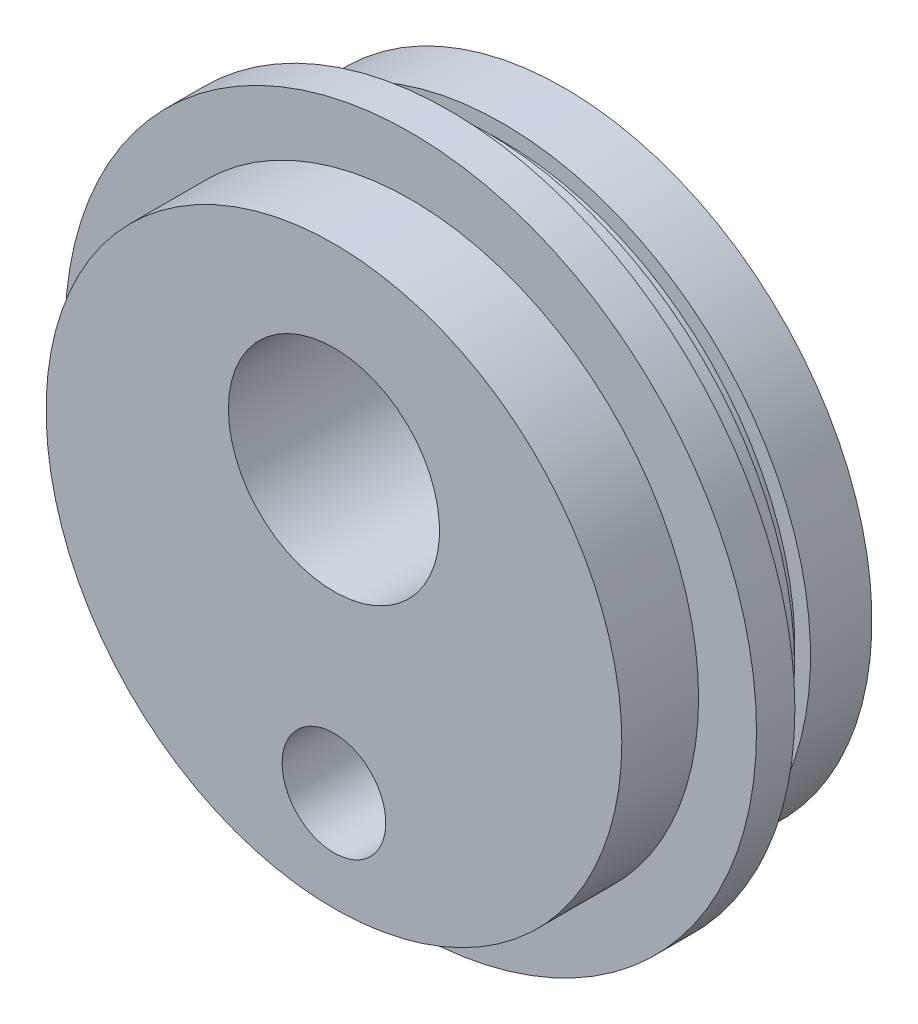
ISO-10303-21;
HEADER;
FILE_DESCRIPTION(('STEP AP214'),'2;1');
FILE_NAME('part.step','',(''),(''),'','','');
FILE_SCHEMA(('AUTOMOTIVE_DESIGN { 1 0 10303 214 1 1 1 1 }'));
ENDSEC;
DATA;
#1=APPLICATION_CONTEXT('core data for automotive mechanical design processes');
#2=APPLICATION_PROTOCOL_DEFINITION('international standard','automotive_design',2000,#1);
#3=PRODUCT_CONTEXT('',#1,'mechanical');
#4=PRODUCT('Part','Part','',(#3));
#5=PRODUCT_RELATED_PRODUCT_CATEGORY('part','',(#4));
#6=PRODUCT_DEFINITION_FORMATION('','',#4);
#7=PRODUCT_DEFINITION_CONTEXT('part definition',#1,'design');
#8=PRODUCT_DEFINITION('design','',#6,#7);
#9=PRODUCT_DEFINITION_SHAPE('','',#8);
#10=(LENGTH_UNIT() NAMED_UNIT(*) SI_UNIT(.MILLI.,.METRE.));
#11=(NAMED_UNIT(*) PLANE_ANGLE_UNIT() SI_UNIT($,.RADIAN.));
#12=(NAMED_UNIT(*) SI_UNIT($,.STERADIAN.) SOLID_ANGLE_UNIT());
#13=UNCERTAINTY_MEASURE_WITH_UNIT(LENGTH_MEASURE(1.E-05),#10,'distance_accuracy_value','');
#14=(GEOMETRIC_REPRESENTATION_CONTEXT(3) GLOBAL_UNCERTAINTY_ASSIGNED_CONTEXT((#13)) GLOBAL_UNIT_ASSIGNED_CONTEXT((#10,
#11,#12)) REPRESENTATION_CONTEXT('',''));
#15=CARTESIAN_POINT('',(0.,0.,0.));
#16=DIRECTION('',(0.,0.,1.));
#17=DIRECTION('',(1.,0.,0.));
#18=AXIS2_PLACEMENT_3D('',#15,#16,#17);
#19=CARTESIAN_POINT('',(0.,1.66533453693773E-13,12.7));
#20=DIRECTION('',(0.,0.,1.));
#21=DIRECTION('',(1.,0.,0.));
#22=AXIS2_PLACEMENT_3D('',#19,#20,#21);
#23=PLANE('',#22);
#24=CARTESIAN_POINT('',(0.,1.66533453693773E-13,12.7));
#25=DIRECTION('',(0.,0.,1.));
#26=DIRECTION('',(1.,0.,0.));
#27=AXIS2_PLACEMENT_3D('',#24,#25,#26);
#28=CIRCLE('',#27,47.625);
#29=CARTESIAN_POINT('',(47.625,1.66533453693773E-13,12.7));
#30=VERTEX_POINT('',#29);
#31=EDGE_CURVE('E62',#30,#30,#28,.T.);
#32=ORIENTED_EDGE('',*,*,#31,.F.);
#33=EDGE_LOOP('',(#32));
#34=FACE_BOUND('',#33,.T.);
#35=CARTESIAN_POINT('',(0.,1.66533453693773E-13,12.7));
#36=DIRECTION('',(0.,0.,1.));
#37=DIRECTION('',(1.,0.,0.));
#38=AXIS2_PLACEMENT_3D('',#35,#36,#37);
#39=CIRCLE('',#38,57.2063948651031);
#40=CARTESIAN_POINT('',(57.2063948651031,1.66533453693773E-13,12.7));
#41=VERTEX_POINT('',#40);
#42=EDGE_CURVE('E59',#41,#41,#39,.T.);
#43=ORIENTED_EDGE('',*,*,#42,.T.);
#44=EDGE_LOOP('',(#43));
#45=FACE_BOUND('',#44,.T.);
#46=ADVANCED_FACE('F38',(#34,#45),#23,.T.);
#47=CARTESIAN_POINT('',(0.,1.66533453693773E-13,12.7));
#48=DIRECTION('',(0.,0.,1.));
#49=DIRECTION('',(1.,0.,0.));
#50=AXIS2_PLACEMENT_3D('',#47,#48,#49);
#51=CYLINDRICAL_SURFACE('',#50,47.625);
#52=ORIENTED_EDGE('',*,*,#31,.T.);
#53=EDGE_LOOP('',(#52));
#54=FACE_BOUND('',#53,.T.);
#55=CARTESIAN_POINT('',(0.,0.,25.4));
#56=DIRECTION('',(0.,0.,1.));
#57=DIRECTION('',(1.,0.,0.));
#58=AXIS2_PLACEMENT_3D('',#55,#56,#57);
#59=CIRCLE('',#58,47.625);
#60=CARTESIAN_POINT('',(47.625,0.,25.4));
#61=VERTEX_POINT('',#60);
#62=EDGE_CURVE('E58',#61,#61,#59,.T.);
#63=ORIENTED_EDGE('',*,*,#62,.F.);
#64=EDGE_LOOP('',(#63));
#65=FACE_BOUND('',#64,.T.);
#66=ADVANCED_FACE('F85',(#54,#65),#51,.T.);
#67=CARTESIAN_POINT('',(0.,0.,25.4));
#68=DIRECTION('',(0.,0.,1.));
#69=DIRECTION('',(1.,0.,0.));
#70=AXIS2_PLACEMENT_3D('',#67,#68,#69);
#71=PLANE('',#70);
#72=CARTESIAN_POINT('',(1.66533453693773E-13,-31.0864832251811,25.4));
#73=DIRECTION('',(0.,0.,-1.));
#74=DIRECTION('',(-1.,0.,0.));
#75=AXIS2_PLACEMENT_3D('',#72,#73,#74);
#76=CIRCLE('',#75,8.5725);
#77=CARTESIAN_POINT('',(-8.57249999999983,-31.0864832251811,25.4));
#78=VERTEX_POINT('',#77);
#79=EDGE_CURVE('E106',#78,#78,#76,.T.);
#80=ORIENTED_EDGE('',*,*,#79,.T.);
#81=EDGE_LOOP('',(#80));
#82=FACE_BOUND('',#81,.T.);
#83=CARTESIAN_POINT('',(0.,15.2399999999999,25.4));
#84=DIRECTION('',(0.,0.,-1.));
#85=DIRECTION('',(-1.,0.,0.));
#86=AXIS2_PLACEMENT_3D('',#83,#84,#85);
#87=CIRCLE('',#86,17.4625);
#88=CARTESIAN_POINT('',(-17.4625,15.2399999999999,25.4));
#89=VERTEX_POINT('',#88);
#90=EDGE_CURVE('E110',#89,#89,#87,.T.);
#91=ORIENTED_EDGE('',*,*,#90,.T.);
#92=EDGE_LOOP('',(#91));
#93=FACE_BOUND('',#92,.T.);
#94=ORIENTED_EDGE('',*,*,#62,.T.);
#95=EDGE_LOOP('',(#94));
#96=FACE_BOUND('',#95,.T.);
#97=ADVANCED_FACE('F91',(#82,#93,#96),#71,.T.);
#98=CARTESIAN_POINT('',(0.,0.,6.35000000000002));
#99=DIRECTION('',(0.,0.,1.));
#100=DIRECTION('',(1.,0.,0.));
#101=AXIS2_PLACEMENT_3D('',#98,#99,#100);
#102=CYLINDRICAL_SURFACE('',#101,57.2063948651031);
#103=CARTESIAN_POINT('',(0.,0.,6.35000000000002));
#104=DIRECTION('',(0.,0.,1.));
#105=DIRECTION('',(1.,0.,0.));
#106=AXIS2_PLACEMENT_3D('',#103,#104,#105);
#107=CIRCLE('',#106,57.2063948651031);
#108=CARTESIAN_POINT('',(57.2063948651031,0.,6.35000000000002));
#109=VERTEX_POINT('',#108);
#110=EDGE_CURVE('E55',#109,#109,#107,.T.);
#111=ORIENTED_EDGE('',*,*,#110,.T.);
#112=EDGE_LOOP('',(#111));
#113=FACE_BOUND('',#112,.T.);
#114=ORIENTED_EDGE('',*,*,#42,.F.);
#115=EDGE_LOOP('',(#114));
#116=FACE_BOUND('',#115,.T.);
#117=ADVANCED_FACE('F80',(#113,#116),#102,.T.);
#118=CARTESIAN_POINT('',(0.,0.,6.35000000000002));
#119=DIRECTION('',(0.,0.,1.));
#120=DIRECTION('',(1.,0.,0.));
#121=AXIS2_PLACEMENT_3D('',#118,#119,#120);
#122=PLANE('',#121);
#123=CARTESIAN_POINT('',(0.,0.,6.35000000000002));
#124=DIRECTION('',(0.,0.,1.));
#125=DIRECTION('',(1.,0.,0.));
#126=AXIS2_PLACEMENT_3D('',#123,#124,#125);
#127=CIRCLE('',#126,50.8);
#128=CARTESIAN_POINT('',(50.8,0.,6.35000000000002));
#129=VERTEX_POINT('',#128);
#130=EDGE_CURVE('E42',#129,#129,#127,.T.);
#131=ORIENTED_EDGE('',*,*,#130,.T.);
#132=EDGE_LOOP('',(#131));
#133=FACE_BOUND('',#132,.T.);
#134=ORIENTED_EDGE('',*,*,#110,.F.);
#135=EDGE_LOOP('',(#134));
#136=FACE_BOUND('',#135,.T.);
#137=ADVANCED_FACE('F73',(#133,#136),#122,.F.);
#138=CARTESIAN_POINT('',(0.,0.,0.));
#139=DIRECTION('',(0.,0.,1.));
#140=DIRECTION('',(1.,0.,0.));
#141=AXIS2_PLACEMENT_3D('',#138,#139,#140);
#142=PLANE('',#141);
#143=CARTESIAN_POINT('',(0.,0.,0.));
#144=DIRECTION('',(0.,0.,-1.));
#145=DIRECTION('',(-1.,0.,0.));
#146=AXIS2_PLACEMENT_3D('',#143,#144,#145);
#147=CIRCLE('',#146,48.3079575650415);
#148=CARTESIAN_POINT('',(-48.3079575650415,0.,0.));
#149=VERTEX_POINT('',#148);
#150=EDGE_CURVE('E11',#149,#149,#147,.T.);
#151=ORIENTED_EDGE('',*,*,#150,.F.);
#152=EDGE_LOOP('',(#151));
#153=FACE_BOUND('',#152,.T.);
#154=CARTESIAN_POINT('',(0.,0.,0.));
#155=DIRECTION('',(0.,0.,1.));
#156=DIRECTION('',(1.,0.,0.));
#157=AXIS2_PLACEMENT_3D('',#154,#155,#156);
#158=CIRCLE('',#157,50.8);
#159=CARTESIAN_POINT('',(50.8,0.,0.));
#160=VERTEX_POINT('',#159);
#161=EDGE_CURVE('E50',#160,#160,#158,.T.);
#162=ORIENTED_EDGE('',*,*,#161,.F.);
#163=EDGE_LOOP('',(#162));
#164=FACE_BOUND('',#163,.T.);
#165=ADVANCED_FACE('F71',(#153,#164),#142,.F.);
#166=CARTESIAN_POINT('',(0.,0.,25.4));
#167=DIRECTION('',(0.,0.,-1.));
#168=DIRECTION('',(-1.,0.,0.));
#169=AXIS2_PLACEMENT_3D('',#166,#167,#168);
#170=CYLINDRICAL_SURFACE('',#169,50.8);
#171=ORIENTED_EDGE('',*,*,#161,.T.);
#172=EDGE_LOOP('',(#171));
#173=FACE_BOUND('',#172,.T.);
#174=ORIENTED_EDGE('',*,*,#130,.F.);
#175=EDGE_LOOP('',(#174));
#176=FACE_BOUND('',#175,.T.);
#177=ADVANCED_FACE('F40',(#173,#176),#170,.T.);
#178=CARTESIAN_POINT('',(0.,1.66533453693773E-13,-2.53999999999999));
#179=DIRECTION('',(0.,0.,1.));
#180=DIRECTION('',(1.,0.,0.));
#181=AXIS2_PLACEMENT_3D('',#178,#179,#180);
#182=CYLINDRICAL_SURFACE('',#181,48.3079575650415);
#183=CARTESIAN_POINT('',(0.,1.66533453693773E-13,-2.53999999999999));
#184=DIRECTION('',(0.,0.,-1.));
#185=DIRECTION('',(-1.,0.,0.));
#186=AXIS2_PLACEMENT_3D('',#183,#184,#185);
#187=CIRCLE('',#186,48.3079575650415);
#188=CARTESIAN_POINT('',(-48.3079575650415,1.66533453693773E-13,-2.53999999999999));
#189=VERTEX_POINT('',#188);
#190=EDGE_CURVE('E53',#189,#189,#187,.T.);
#191=ORIENTED_EDGE('',*,*,#190,.F.);
#192=EDGE_LOOP('',(#191));
#193=FACE_BOUND('',#192,.T.);
#194=ORIENTED_EDGE('',*,*,#150,.T.);
#195=EDGE_LOOP('',(#194));
#196=FACE_BOUND('',#195,.T.);
#197=ADVANCED_FACE('F79',(#193,#196),#182,.T.);
#198=CARTESIAN_POINT('',(1.66533453693773E-13,0.,-12.7));
#199=DIRECTION('',(0.,0.,1.));
#200=DIRECTION('',(1.,0.,0.));
#201=AXIS2_PLACEMENT_3D('',#198,#199,#200);
#202=CYLINDRICAL_SURFACE('',#201,50.9005831859003);
#203=CARTESIAN_POINT('',(1.66533453693773E-13,0.,-12.7));
#204=DIRECTION('',(0.,0.,-1.));
#205=DIRECTION('',(-1.,0.,0.));
#206=AXIS2_PLACEMENT_3D('',#203,#204,#205);
#207=CIRCLE('',#206,50.9005831859003);
#208=CARTESIAN_POINT('',(-50.9005831859001,0.,-12.7));
#209=VERTEX_POINT('',#208);
#210=EDGE_CURVE('E118',#209,#209,#207,.T.);
#211=ORIENTED_EDGE('',*,*,#210,.F.);
#212=EDGE_LOOP('',(#211));
#213=FACE_BOUND('',#212,.T.);
#214=CARTESIAN_POINT('',(0.,1.66533453693773E-13,-2.53999999999999));
#215=DIRECTION('',(0.,0.,-1.));
#216=DIRECTION('',(-1.,0.,0.));
#217=AXIS2_PLACEMENT_3D('',#214,#215,#216);
#218=CIRCLE('',#217,50.9005831859003);
#219=CARTESIAN_POINT('',(-50.9005831859003,1.66533453693773E-13,-2.53999999999999));
#220=VERTEX_POINT('',#219);
#221=EDGE_CURVE('E114',#220,#220,#218,.T.);
#222=ORIENTED_EDGE('',*,*,#221,.T.);
#223=EDGE_LOOP('',(#222));
#224=FACE_BOUND('',#223,.T.);
#225=ADVANCED_FACE('F133',(#213,#224),#202,.T.);
#226=CARTESIAN_POINT('',(1.66533453693773E-13,0.,-12.7));
#227=DIRECTION('',(0.,0.,-1.));
#228=DIRECTION('',(-1.,0.,0.));
#229=AXIS2_PLACEMENT_3D('',#226,#227,#228);
#230=PLANE('',#229);
#231=CARTESIAN_POINT('',(1.66533453693773E-13,-31.086483225181,-12.7));
#232=DIRECTION('',(0.,0.,-1.));
#233=DIRECTION('',(-1.,0.,0.));
#234=AXIS2_PLACEMENT_3D('',#231,#232,#233);
#235=CIRCLE('',#234,8.5725);
#236=CARTESIAN_POINT('',(-8.57249999999983,-31.086483225181,-12.7));
#237=VERTEX_POINT('',#236);
#238=EDGE_CURVE('E158',#237,#237,#235,.T.);
#239=ORIENTED_EDGE('',*,*,#238,.F.);
#240=EDGE_LOOP('',(#239));
#241=FACE_BOUND('',#240,.T.);
#242=CARTESIAN_POINT('',(1.66533453693773E-13,15.2399999999999,-12.7));
#243=DIRECTION('',(0.,0.,-1.));
#244=DIRECTION('',(-1.,0.,0.));
#245=AXIS2_PLACEMENT_3D('',#242,#243,#244);
#246=CIRCLE('',#245,17.4625);
#247=CARTESIAN_POINT('',(-17.4624999999998,15.2399999999999,-12.7));
#248=VERTEX_POINT('',#247);
#249=EDGE_CURVE('E115',#248,#248,#246,.T.);
#250=ORIENTED_EDGE('',*,*,#249,.F.);
#251=EDGE_LOOP('',(#250));
#252=FACE_BOUND('',#251,.T.);
#253=ORIENTED_EDGE('',*,*,#210,.T.);
#254=EDGE_LOOP('',(#253));
#255=FACE_BOUND('',#254,.T.);
#256=ADVANCED_FACE('F138',(#241,#252,#255),#230,.T.);
#257=CARTESIAN_POINT('',(0.,1.66533453693773E-13,-2.53999999999999));
#258=DIRECTION('',(0.,0.,-1.));
#259=DIRECTION('',(-1.,0.,0.));
#260=AXIS2_PLACEMENT_3D('',#257,#258,#259);
#261=PLANE('',#260);
#262=ORIENTED_EDGE('',*,*,#190,.T.);
#263=EDGE_LOOP('',(#262));
#264=FACE_BOUND('',#263,.T.);
#265=ORIENTED_EDGE('',*,*,#221,.F.);
#266=EDGE_LOOP('',(#265));
#267=FACE_BOUND('',#266,.T.);
#268=ADVANCED_FACE('F129',(#264,#267),#261,.F.);
#269=CARTESIAN_POINT('',(0.,15.2399999999999,25.4));
#270=DIRECTION('',(0.,0.,-1.));
#271=DIRECTION('',(-1.,0.,0.));
#272=AXIS2_PLACEMENT_3D('',#269,#270,#271);
#273=CYLINDRICAL_SURFACE('',#272,17.4625);
#274=ORIENTED_EDGE('',*,*,#90,.F.);
#275=EDGE_LOOP('',(#274));
#276=FACE_BOUND('',#275,.T.);
#277=ORIENTED_EDGE('',*,*,#249,.T.);
#278=EDGE_LOOP('',(#277));
#279=FACE_BOUND('',#278,.T.);
#280=ADVANCED_FACE('F144',(#276,#279),#273,.F.);
#281=CARTESIAN_POINT('',(1.66533453693773E-13,-31.0864832251811,25.4));
#282=DIRECTION('',(0.,0.,-1.));
#283=DIRECTION('',(-1.,0.,0.));
#284=AXIS2_PLACEMENT_3D('',#281,#282,#283);
#285=CYLINDRICAL_SURFACE('',#284,8.5725);
#286=ORIENTED_EDGE('',*,*,#79,.F.);
#287=EDGE_LOOP('',(#286));
#288=FACE_BOUND('',#287,.T.);
#289=ORIENTED_EDGE('',*,*,#238,.T.);
#290=EDGE_LOOP('',(#289));
#291=FACE_BOUND('',#290,.T.);
#292=ADVANCED_FACE('F150',(#288,#291),#285,.F.);
#293=CLOSED_SHELL('',(#46,#66,#97,#117,#137,#165,#177,#197,#225,#256,#268,#280,#292));
#294=MANIFOLD_SOLID_BREP('B2',#293);
#295=ADVANCED_BREP_SHAPE_REPRESENTATION('',(#18,#294),#14);
#296=SHAPE_DEFINITION_REPRESENTATION(#9,#295);
ENDSEC;
END-ISO-10303-21;
